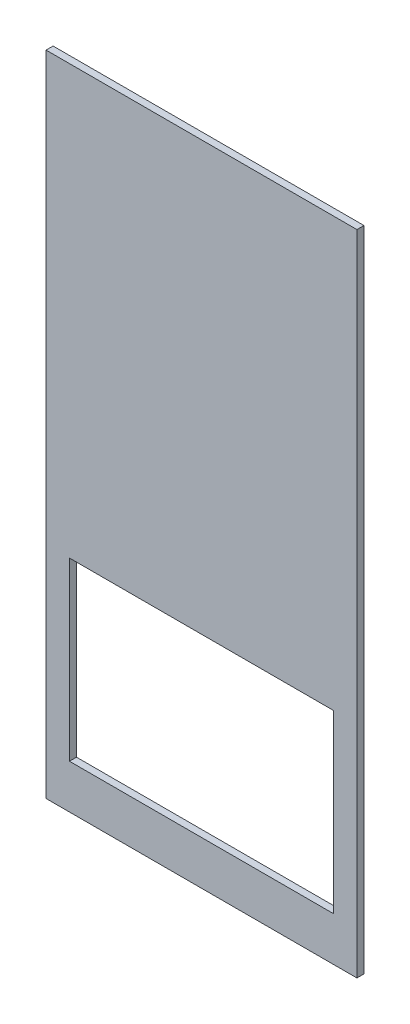
ISO-10303-21;
HEADER;
FILE_DESCRIPTION(('STEP AP214'),'2;1');
FILE_NAME('part.step','',(''),(''),'','','');
FILE_SCHEMA(('AUTOMOTIVE_DESIGN { 1 0 10303 214 1 1 1 1 }'));
ENDSEC;
DATA;
#1=APPLICATION_CONTEXT('core data for automotive mechanical design processes');
#2=APPLICATION_PROTOCOL_DEFINITION('international standard','automotive_design',2000,#1);
#3=PRODUCT_CONTEXT('',#1,'mechanical');
#4=PRODUCT('Part','Part','',(#3));
#5=PRODUCT_RELATED_PRODUCT_CATEGORY('part','',(#4));
#6=PRODUCT_DEFINITION_FORMATION('','',#4);
#7=PRODUCT_DEFINITION_CONTEXT('part definition',#1,'design');
#8=PRODUCT_DEFINITION('design','',#6,#7);
#9=PRODUCT_DEFINITION_SHAPE('','',#8);
#10=(LENGTH_UNIT() NAMED_UNIT(*) SI_UNIT(.MILLI.,.METRE.));
#11=(NAMED_UNIT(*) PLANE_ANGLE_UNIT() SI_UNIT($,.RADIAN.));
#12=(NAMED_UNIT(*) SI_UNIT($,.STERADIAN.) SOLID_ANGLE_UNIT());
#13=UNCERTAINTY_MEASURE_WITH_UNIT(LENGTH_MEASURE(1.E-05),#10,'distance_accuracy_value','');
#14=(GEOMETRIC_REPRESENTATION_CONTEXT(3) GLOBAL_UNCERTAINTY_ASSIGNED_CONTEXT((#13)) GLOBAL_UNIT_ASSIGNED_CONTEXT((#10,
#11,#12)) REPRESENTATION_CONTEXT('',''));
#15=CARTESIAN_POINT('',(0.,0.,0.));
#16=DIRECTION('',(0.,0.,1.));
#17=DIRECTION('',(1.,0.,0.));
#18=AXIS2_PLACEMENT_3D('',#15,#16,#17);
#19=CARTESIAN_POINT('',(0.,0.,6.));
#20=DIRECTION('',(0.,0.,-1.));
#21=DIRECTION('',(-1.,0.,0.));
#22=AXIS2_PLACEMENT_3D('',#19,#20,#21);
#23=PLANE('',#22);
#24=DIRECTION('',(0.,-1.,0.));
#25=VECTOR('',#24,1.);
#26=CARTESIAN_POINT('',(0.,0.,6.));
#27=LINE('',#26,#25);
#28=CARTESIAN_POINT('',(0.,552.5,6.));
#29=VERTEX_POINT('',#28);
#30=CARTESIAN_POINT('',(0.,0.,6.));
#31=VERTEX_POINT('',#30);
#32=EDGE_CURVE('E135',#29,#31,#27,.T.);
#33=ORIENTED_EDGE('',*,*,#32,.T.);
#34=DIRECTION('',(1.,0.,0.));
#35=VECTOR('',#34,1.);
#36=CARTESIAN_POINT('',(0.,0.,6.));
#37=LINE('',#36,#35);
#38=CARTESIAN_POINT('',(265.,0.,6.));
#39=VERTEX_POINT('',#38);
#40=EDGE_CURVE('E138',#31,#39,#37,.T.);
#41=ORIENTED_EDGE('',*,*,#40,.T.);
#42=DIRECTION('',(0.,1.,0.));
#43=VECTOR('',#42,1.);
#44=CARTESIAN_POINT('',(265.,0.,6.));
#45=LINE('',#44,#43);
#46=CARTESIAN_POINT('',(265.,552.5,6.));
#47=VERTEX_POINT('',#46);
#48=EDGE_CURVE('E141',#39,#47,#45,.T.);
#49=ORIENTED_EDGE('',*,*,#48,.T.);
#50=DIRECTION('',(-1.,0.,0.));
#51=VECTOR('',#50,1.);
#52=CARTESIAN_POINT('',(0.,552.5,6.));
#53=LINE('',#52,#51);
#54=EDGE_CURVE('E143',#47,#29,#53,.T.);
#55=ORIENTED_EDGE('',*,*,#54,.T.);
#56=EDGE_LOOP('',(#33,#41,#49,#55));
#57=FACE_BOUND('',#56,.T.);
#58=DIRECTION('',(0.,-1.,0.));
#59=VECTOR('',#58,1.);
#60=CARTESIAN_POINT('',(19.9999999999999,187.5,6.));
#61=LINE('',#60,#59);
#62=CARTESIAN_POINT('',(19.9999999999999,187.5,6.));
#63=VERTEX_POINT('',#62);
#64=CARTESIAN_POINT('',(20.,37.5,6.));
#65=VERTEX_POINT('',#64);
#66=EDGE_CURVE('E99',#63,#65,#61,.T.);
#67=ORIENTED_EDGE('',*,*,#66,.F.);
#68=DIRECTION('',(-1.,0.,0.));
#69=VECTOR('',#68,1.);
#70=CARTESIAN_POINT('',(19.9999999999999,187.5,6.));
#71=LINE('',#70,#69);
#72=CARTESIAN_POINT('',(245.,187.5,6.));
#73=VERTEX_POINT('',#72);
#74=EDGE_CURVE('E121',#73,#63,#71,.T.);
#75=ORIENTED_EDGE('',*,*,#74,.F.);
#76=DIRECTION('',(0.,1.,0.));
#77=VECTOR('',#76,1.);
#78=CARTESIAN_POINT('',(245.,187.5,6.));
#79=LINE('',#78,#77);
#80=CARTESIAN_POINT('',(245.,37.5,6.));
#81=VERTEX_POINT('',#80);
#82=EDGE_CURVE('E119',#81,#73,#79,.T.);
#83=ORIENTED_EDGE('',*,*,#82,.F.);
#84=DIRECTION('',(1.,0.,0.));
#85=VECTOR('',#84,1.);
#86=CARTESIAN_POINT('',(20.,37.5,6.));
#87=LINE('',#86,#85);
#88=EDGE_CURVE('E107',#65,#81,#87,.T.);
#89=ORIENTED_EDGE('',*,*,#88,.F.);
#90=EDGE_LOOP('',(#67,#75,#83,#89));
#91=FACE_BOUND('',#90,.T.);
#92=ADVANCED_FACE('F34',(#57,#91),#23,.F.);
#93=CARTESIAN_POINT('',(0.,0.,0.));
#94=DIRECTION('',(0.,0.,-1.));
#95=DIRECTION('',(-1.,0.,0.));
#96=AXIS2_PLACEMENT_3D('',#93,#94,#95);
#97=PLANE('',#96);
#98=DIRECTION('',(0.,-1.,0.));
#99=VECTOR('',#98,1.);
#100=CARTESIAN_POINT('',(0.,0.,0.));
#101=LINE('',#100,#99);
#102=CARTESIAN_POINT('',(0.,552.5,0.));
#103=VERTEX_POINT('',#102);
#104=CARTESIAN_POINT('',(0.,0.,0.));
#105=VERTEX_POINT('',#104);
#106=EDGE_CURVE('E115',#103,#105,#101,.T.);
#107=ORIENTED_EDGE('',*,*,#106,.F.);
#108=DIRECTION('',(-1.,0.,0.));
#109=VECTOR('',#108,1.);
#110=CARTESIAN_POINT('',(0.,552.5,0.));
#111=LINE('',#110,#109);
#112=CARTESIAN_POINT('',(265.,552.5,0.));
#113=VERTEX_POINT('',#112);
#114=EDGE_CURVE('E139',#113,#103,#111,.T.);
#115=ORIENTED_EDGE('',*,*,#114,.F.);
#116=DIRECTION('',(0.,1.,0.));
#117=VECTOR('',#116,1.);
#118=CARTESIAN_POINT('',(265.,0.,0.));
#119=LINE('',#118,#117);
#120=CARTESIAN_POINT('',(265.,0.,0.));
#121=VERTEX_POINT('',#120);
#122=EDGE_CURVE('E150',#121,#113,#119,.T.);
#123=ORIENTED_EDGE('',*,*,#122,.F.);
#124=DIRECTION('',(1.,0.,0.));
#125=VECTOR('',#124,1.);
#126=CARTESIAN_POINT('',(0.,0.,0.));
#127=LINE('',#126,#125);
#128=EDGE_CURVE('E148',#105,#121,#127,.T.);
#129=ORIENTED_EDGE('',*,*,#128,.F.);
#130=EDGE_LOOP('',(#107,#115,#123,#129));
#131=FACE_BOUND('',#130,.T.);
#132=DIRECTION('',(-1.,0.,0.));
#133=VECTOR('',#132,1.);
#134=CARTESIAN_POINT('',(19.9999999999999,187.5,0.));
#135=LINE('',#134,#133);
#136=CARTESIAN_POINT('',(245.,187.5,0.));
#137=VERTEX_POINT('',#136);
#138=CARTESIAN_POINT('',(19.9999999999999,187.5,0.));
#139=VERTEX_POINT('',#138);
#140=EDGE_CURVE('E108',#137,#139,#135,.T.);
#141=ORIENTED_EDGE('',*,*,#140,.T.);
#142=DIRECTION('',(0.,-1.,0.));
#143=VECTOR('',#142,1.);
#144=CARTESIAN_POINT('',(19.9999999999999,187.5,0.));
#145=LINE('',#144,#143);
#146=CARTESIAN_POINT('',(20.,37.5,0.));
#147=VERTEX_POINT('',#146);
#148=EDGE_CURVE('E57',#139,#147,#145,.T.);
#149=ORIENTED_EDGE('',*,*,#148,.T.);
#150=DIRECTION('',(1.,0.,0.));
#151=VECTOR('',#150,1.);
#152=CARTESIAN_POINT('',(20.,37.5,0.));
#153=LINE('',#152,#151);
#154=CARTESIAN_POINT('',(245.,37.5,0.));
#155=VERTEX_POINT('',#154);
#156=EDGE_CURVE('E114',#147,#155,#153,.T.);
#157=ORIENTED_EDGE('',*,*,#156,.T.);
#158=DIRECTION('',(0.,1.,0.));
#159=VECTOR('',#158,1.);
#160=CARTESIAN_POINT('',(245.,187.5,0.));
#161=LINE('',#160,#159);
#162=EDGE_CURVE('E127',#155,#137,#161,.T.);
#163=ORIENTED_EDGE('',*,*,#162,.T.);
#164=EDGE_LOOP('',(#141,#149,#157,#163));
#165=FACE_BOUND('',#164,.T.);
#166=ADVANCED_FACE('F168',(#131,#165),#97,.T.);
#167=CARTESIAN_POINT('',(0.,0.,6.));
#168=DIRECTION('',(1.,0.,0.));
#169=DIRECTION('',(0.,1.,0.));
#170=AXIS2_PLACEMENT_3D('',#167,#168,#169);
#171=PLANE('',#170);
#172=ORIENTED_EDGE('',*,*,#106,.T.);
#173=DIRECTION('',(0.,0.,-1.));
#174=VECTOR('',#173,1.);
#175=CARTESIAN_POINT('',(0.,0.,6.));
#176=LINE('',#175,#174);
#177=EDGE_CURVE('E11',#31,#105,#176,.T.);
#178=ORIENTED_EDGE('',*,*,#177,.F.);
#179=ORIENTED_EDGE('',*,*,#32,.F.);
#180=DIRECTION('',(0.,0.,-1.));
#181=VECTOR('',#180,1.);
#182=CARTESIAN_POINT('',(0.,552.5,6.));
#183=LINE('',#182,#181);
#184=EDGE_CURVE('E145',#29,#103,#183,.T.);
#185=ORIENTED_EDGE('',*,*,#184,.T.);
#186=EDGE_LOOP('',(#172,#178,#179,#185));
#187=FACE_BOUND('',#186,.T.);
#188=ADVANCED_FACE('F36',(#187),#171,.F.);
#189=CARTESIAN_POINT('',(0.,0.,6.));
#190=DIRECTION('',(0.,1.,0.));
#191=DIRECTION('',(0.,0.,1.));
#192=AXIS2_PLACEMENT_3D('',#189,#190,#191);
#193=PLANE('',#192);
#194=ORIENTED_EDGE('',*,*,#128,.T.);
#195=DIRECTION('',(0.,0.,-1.));
#196=VECTOR('',#195,1.);
#197=CARTESIAN_POINT('',(265.,0.,6.));
#198=LINE('',#197,#196);
#199=EDGE_CURVE('E42',#39,#121,#198,.T.);
#200=ORIENTED_EDGE('',*,*,#199,.F.);
#201=ORIENTED_EDGE('',*,*,#40,.F.);
#202=ORIENTED_EDGE('',*,*,#177,.T.);
#203=EDGE_LOOP('',(#194,#200,#201,#202));
#204=FACE_BOUND('',#203,.T.);
#205=ADVANCED_FACE('F178',(#204),#193,.F.);
#206=CARTESIAN_POINT('',(265.,0.,6.));
#207=DIRECTION('',(-1.,0.,0.));
#208=DIRECTION('',(0.,0.,1.));
#209=AXIS2_PLACEMENT_3D('',#206,#207,#208);
#210=PLANE('',#209);
#211=ORIENTED_EDGE('',*,*,#122,.T.);
#212=DIRECTION('',(0.,0.,-1.));
#213=VECTOR('',#212,1.);
#214=CARTESIAN_POINT('',(265.,552.5,6.));
#215=LINE('',#214,#213);
#216=EDGE_CURVE('E155',#47,#113,#215,.T.);
#217=ORIENTED_EDGE('',*,*,#216,.F.);
#218=ORIENTED_EDGE('',*,*,#48,.F.);
#219=ORIENTED_EDGE('',*,*,#199,.T.);
#220=EDGE_LOOP('',(#211,#217,#218,#219));
#221=FACE_BOUND('',#220,.T.);
#222=ADVANCED_FACE('F162',(#221),#210,.F.);
#223=CARTESIAN_POINT('',(0.,552.5,6.));
#224=DIRECTION('',(0.,-1.,0.));
#225=DIRECTION('',(0.,0.,-1.));
#226=AXIS2_PLACEMENT_3D('',#223,#224,#225);
#227=PLANE('',#226);
#228=ORIENTED_EDGE('',*,*,#114,.T.);
#229=ORIENTED_EDGE('',*,*,#184,.F.);
#230=ORIENTED_EDGE('',*,*,#54,.F.);
#231=ORIENTED_EDGE('',*,*,#216,.T.);
#232=EDGE_LOOP('',(#228,#229,#230,#231));
#233=FACE_BOUND('',#232,.T.);
#234=ADVANCED_FACE('F172',(#233),#227,.F.);
#235=CARTESIAN_POINT('',(19.9999999999999,187.5,6.));
#236=DIRECTION('',(1.,0.,0.));
#237=DIRECTION('',(0.,1.,0.));
#238=AXIS2_PLACEMENT_3D('',#235,#236,#237);
#239=PLANE('',#238);
#240=ORIENTED_EDGE('',*,*,#148,.F.);
#241=DIRECTION('',(0.,0.,-1.));
#242=VECTOR('',#241,1.);
#243=CARTESIAN_POINT('',(19.9999999999999,187.5,6.));
#244=LINE('',#243,#242);
#245=EDGE_CURVE('E103',#63,#139,#244,.T.);
#246=ORIENTED_EDGE('',*,*,#245,.F.);
#247=ORIENTED_EDGE('',*,*,#66,.T.);
#248=DIRECTION('',(0.,0.,-1.));
#249=VECTOR('',#248,1.);
#250=CARTESIAN_POINT('',(20.,37.5,6.));
#251=LINE('',#250,#249);
#252=EDGE_CURVE('E102',#65,#147,#251,.T.);
#253=ORIENTED_EDGE('',*,*,#252,.T.);
#254=EDGE_LOOP('',(#240,#246,#247,#253));
#255=FACE_BOUND('',#254,.T.);
#256=ADVANCED_FACE('F101',(#255),#239,.T.);
#257=CARTESIAN_POINT('',(20.,37.5,6.));
#258=DIRECTION('',(0.,1.,0.));
#259=DIRECTION('',(0.,0.,1.));
#260=AXIS2_PLACEMENT_3D('',#257,#258,#259);
#261=PLANE('',#260);
#262=ORIENTED_EDGE('',*,*,#156,.F.);
#263=ORIENTED_EDGE('',*,*,#252,.F.);
#264=ORIENTED_EDGE('',*,*,#88,.T.);
#265=DIRECTION('',(0.,0.,-1.));
#266=VECTOR('',#265,1.);
#267=CARTESIAN_POINT('',(245.,37.5,6.));
#268=LINE('',#267,#266);
#269=EDGE_CURVE('E116',#81,#155,#268,.T.);
#270=ORIENTED_EDGE('',*,*,#269,.T.);
#271=EDGE_LOOP('',(#262,#263,#264,#270));
#272=FACE_BOUND('',#271,.T.);
#273=ADVANCED_FACE('F111',(#272),#261,.T.);
#274=CARTESIAN_POINT('',(245.,187.5,6.));
#275=DIRECTION('',(-1.,0.,0.));
#276=DIRECTION('',(0.,-1.,0.));
#277=AXIS2_PLACEMENT_3D('',#274,#275,#276);
#278=PLANE('',#277);
#279=ORIENTED_EDGE('',*,*,#162,.F.);
#280=ORIENTED_EDGE('',*,*,#269,.F.);
#281=ORIENTED_EDGE('',*,*,#82,.T.);
#282=DIRECTION('',(0.,0.,-1.));
#283=VECTOR('',#282,1.);
#284=CARTESIAN_POINT('',(245.,187.5,6.));
#285=LINE('',#284,#283);
#286=EDGE_CURVE('E49',#73,#137,#285,.T.);
#287=ORIENTED_EDGE('',*,*,#286,.T.);
#288=EDGE_LOOP('',(#279,#280,#281,#287));
#289=FACE_BOUND('',#288,.T.);
#290=ADVANCED_FACE('F201',(#289),#278,.T.);
#291=CARTESIAN_POINT('',(19.9999999999999,187.5,6.));
#292=DIRECTION('',(0.,-1.,0.));
#293=DIRECTION('',(0.,0.,-1.));
#294=AXIS2_PLACEMENT_3D('',#291,#292,#293);
#295=PLANE('',#294);
#296=ORIENTED_EDGE('',*,*,#140,.F.);
#297=ORIENTED_EDGE('',*,*,#286,.F.);
#298=ORIENTED_EDGE('',*,*,#74,.T.);
#299=ORIENTED_EDGE('',*,*,#245,.T.);
#300=EDGE_LOOP('',(#296,#297,#298,#299));
#301=FACE_BOUND('',#300,.T.);
#302=ADVANCED_FACE('F205',(#301),#295,.T.);
#303=CLOSED_SHELL('',(#92,#166,#188,#205,#222,#234,#256,#273,#290,#302));
#304=MANIFOLD_SOLID_BREP('B2',#303);
#305=ADVANCED_BREP_SHAPE_REPRESENTATION('',(#18,#304),#14);
#306=SHAPE_DEFINITION_REPRESENTATION(#9,#305);
ENDSEC;
END-ISO-10303-21;
